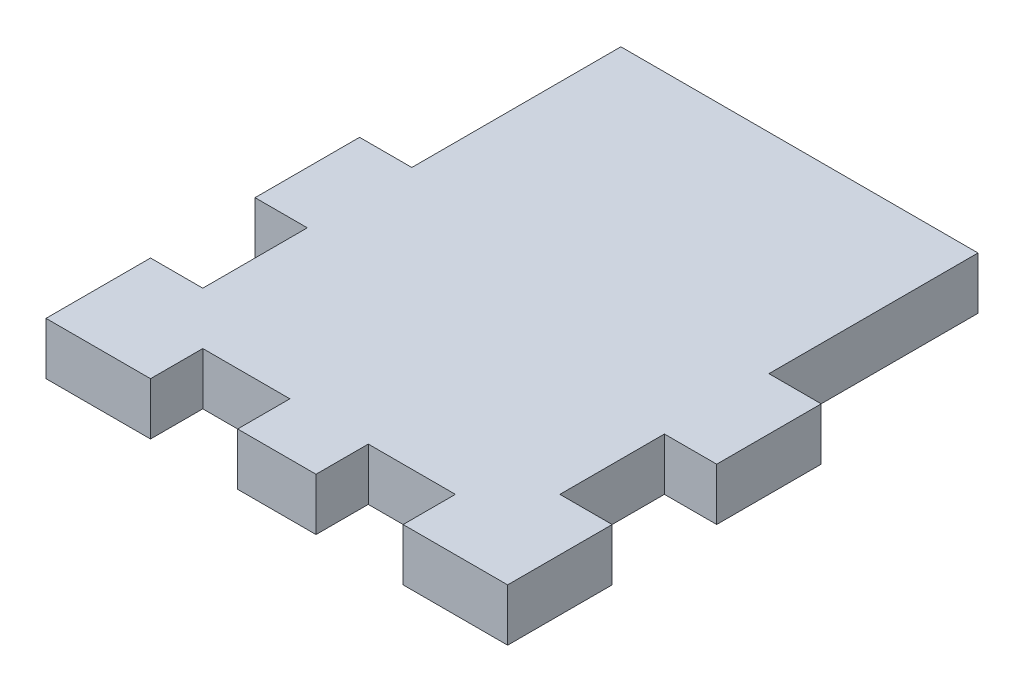
ISO-10303-21;
HEADER;
FILE_DESCRIPTION(('STEP AP214'),'2;1');
FILE_NAME('part.step','',(''),(''),'','','');
FILE_SCHEMA(('AUTOMOTIVE_DESIGN { 1 0 10303 214 1 1 1 1 }'));
ENDSEC;
DATA;
#1=APPLICATION_CONTEXT('core data for automotive mechanical design processes');
#2=APPLICATION_PROTOCOL_DEFINITION('international standard','automotive_design',2000,#1);
#3=PRODUCT_CONTEXT('',#1,'mechanical');
#4=PRODUCT('Part','Part','',(#3));
#5=PRODUCT_RELATED_PRODUCT_CATEGORY('part','',(#4));
#6=PRODUCT_DEFINITION_FORMATION('','',#4);
#7=PRODUCT_DEFINITION_CONTEXT('part definition',#1,'design');
#8=PRODUCT_DEFINITION('design','',#6,#7);
#9=PRODUCT_DEFINITION_SHAPE('','',#8);
#10=(LENGTH_UNIT() NAMED_UNIT(*) SI_UNIT(.MILLI.,.METRE.));
#11=(NAMED_UNIT(*) PLANE_ANGLE_UNIT() SI_UNIT($,.RADIAN.));
#12=(NAMED_UNIT(*) SI_UNIT($,.STERADIAN.) SOLID_ANGLE_UNIT());
#13=UNCERTAINTY_MEASURE_WITH_UNIT(LENGTH_MEASURE(1.E-05),#10,'distance_accuracy_value','');
#14=(GEOMETRIC_REPRESENTATION_CONTEXT(3) GLOBAL_UNCERTAINTY_ASSIGNED_CONTEXT((#13)) GLOBAL_UNIT_ASSIGNED_CONTEXT((#10,
#11,#12)) REPRESENTATION_CONTEXT('',''));
#15=CARTESIAN_POINT('',(0.,0.,0.));
#16=DIRECTION('',(0.,0.,1.));
#17=DIRECTION('',(1.,0.,0.));
#18=AXIS2_PLACEMENT_3D('',#15,#16,#17);
#19=CARTESIAN_POINT('',(6.,3.,0.));
#20=DIRECTION('',(0.,0.,-1.));
#21=DIRECTION('',(-1.,0.,0.));
#22=AXIS2_PLACEMENT_3D('',#19,#20,#21);
#23=PLANE('',#22);
#24=DIRECTION('',(1.,0.,0.));
#25=VECTOR('',#24,1.);
#26=CARTESIAN_POINT('',(6.,0.,0.));
#27=LINE('',#26,#25);
#28=CARTESIAN_POINT('',(0.,0.,0.));
#29=VERTEX_POINT('',#28);
#30=CARTESIAN_POINT('',(6.,0.,0.));
#31=VERTEX_POINT('',#30);
#32=EDGE_CURVE('E225',#29,#31,#27,.T.);
#33=ORIENTED_EDGE('',*,*,#32,.T.);
#34=DIRECTION('',(0.,-1.,0.));
#35=VECTOR('',#34,1.);
#36=CARTESIAN_POINT('',(6.,3.,0.));
#37=LINE('',#36,#35);
#38=CARTESIAN_POINT('',(6.,3.,0.));
#39=VERTEX_POINT('',#38);
#40=EDGE_CURVE('E11',#39,#31,#37,.T.);
#41=ORIENTED_EDGE('',*,*,#40,.F.);
#42=DIRECTION('',(1.,0.,0.));
#43=VECTOR('',#42,1.);
#44=CARTESIAN_POINT('',(6.,3.,0.));
#45=LINE('',#44,#43);
#46=CARTESIAN_POINT('',(0.,3.,0.));
#47=VERTEX_POINT('',#46);
#48=EDGE_CURVE('E271',#47,#39,#45,.T.);
#49=ORIENTED_EDGE('',*,*,#48,.F.);
#50=DIRECTION('',(0.,-1.,0.));
#51=VECTOR('',#50,1.);
#52=CARTESIAN_POINT('',(0.,3.,0.));
#53=LINE('',#52,#51);
#54=EDGE_CURVE('E221',#47,#29,#53,.T.);
#55=ORIENTED_EDGE('',*,*,#54,.T.);
#56=EDGE_LOOP('',(#33,#41,#49,#55));
#57=FACE_BOUND('',#56,.T.);
#58=ADVANCED_FACE('F33',(#57),#23,.F.);
#59=CARTESIAN_POINT('',(6.,3.,-3.));
#60=DIRECTION('',(-1.,0.,0.));
#61=DIRECTION('',(0.,0.,1.));
#62=AXIS2_PLACEMENT_3D('',#59,#60,#61);
#63=PLANE('',#62);
#64=DIRECTION('',(0.,0.,-1.));
#65=VECTOR('',#64,1.);
#66=CARTESIAN_POINT('',(6.,0.,-3.));
#67=LINE('',#66,#65);
#68=CARTESIAN_POINT('',(6.,0.,-3.));
#69=VERTEX_POINT('',#68);
#70=EDGE_CURVE('E228',#31,#69,#67,.T.);
#71=ORIENTED_EDGE('',*,*,#70,.T.);
#72=DIRECTION('',(0.,-1.,0.));
#73=VECTOR('',#72,1.);
#74=CARTESIAN_POINT('',(6.,3.,-3.));
#75=LINE('',#74,#73);
#76=CARTESIAN_POINT('',(6.,3.,-3.));
#77=VERTEX_POINT('',#76);
#78=EDGE_CURVE('E41',#77,#69,#75,.T.);
#79=ORIENTED_EDGE('',*,*,#78,.F.);
#80=DIRECTION('',(0.,0.,-1.));
#81=VECTOR('',#80,1.);
#82=CARTESIAN_POINT('',(6.,3.,-3.));
#83=LINE('',#82,#81);
#84=EDGE_CURVE('E140',#39,#77,#83,.T.);
#85=ORIENTED_EDGE('',*,*,#84,.F.);
#86=ORIENTED_EDGE('',*,*,#40,.T.);
#87=EDGE_LOOP('',(#71,#79,#85,#86));
#88=FACE_BOUND('',#87,.T.);
#89=ADVANCED_FACE('F409',(#88),#63,.F.);
#90=CARTESIAN_POINT('',(11.,3.,-3.));
#91=DIRECTION('',(0.,0.,-1.));
#92=DIRECTION('',(-1.,0.,0.));
#93=AXIS2_PLACEMENT_3D('',#90,#91,#92);
#94=PLANE('',#93);
#95=DIRECTION('',(1.,0.,0.));
#96=VECTOR('',#95,1.);
#97=CARTESIAN_POINT('',(11.,0.,-3.));
#98=LINE('',#97,#96);
#99=CARTESIAN_POINT('',(11.,0.,-3.));
#100=VERTEX_POINT('',#99);
#101=EDGE_CURVE('E230',#69,#100,#98,.T.);
#102=ORIENTED_EDGE('',*,*,#101,.T.);
#103=DIRECTION('',(0.,-1.,0.));
#104=VECTOR('',#103,1.);
#105=CARTESIAN_POINT('',(11.,3.,-3.));
#106=LINE('',#105,#104);
#107=CARTESIAN_POINT('',(11.,3.,-3.));
#108=VERTEX_POINT('',#107);
#109=EDGE_CURVE('E326',#108,#100,#106,.T.);
#110=ORIENTED_EDGE('',*,*,#109,.F.);
#111=DIRECTION('',(1.,0.,0.));
#112=VECTOR('',#111,1.);
#113=CARTESIAN_POINT('',(11.,3.,-3.));
#114=LINE('',#113,#112);
#115=EDGE_CURVE('E334',#77,#108,#114,.T.);
#116=ORIENTED_EDGE('',*,*,#115,.F.);
#117=ORIENTED_EDGE('',*,*,#78,.T.);
#118=EDGE_LOOP('',(#102,#110,#116,#117));
#119=FACE_BOUND('',#118,.T.);
#120=ADVANCED_FACE('F332',(#119),#94,.F.);
#121=CARTESIAN_POINT('',(11.,3.,0.));
#122=DIRECTION('',(1.,0.,0.));
#123=DIRECTION('',(0.,0.,-1.));
#124=AXIS2_PLACEMENT_3D('',#121,#122,#123);
#125=PLANE('',#124);
#126=DIRECTION('',(0.,0.,1.));
#127=VECTOR('',#126,1.);
#128=CARTESIAN_POINT('',(11.,0.,0.));
#129=LINE('',#128,#127);
#130=CARTESIAN_POINT('',(11.,0.,0.));
#131=VERTEX_POINT('',#130);
#132=EDGE_CURVE('E232',#100,#131,#129,.T.);
#133=ORIENTED_EDGE('',*,*,#132,.T.);
#134=DIRECTION('',(0.,-1.,0.));
#135=VECTOR('',#134,1.);
#136=CARTESIAN_POINT('',(11.,3.,0.));
#137=LINE('',#136,#135);
#138=CARTESIAN_POINT('',(11.,3.,0.));
#139=VERTEX_POINT('',#138);
#140=EDGE_CURVE('E323',#139,#131,#137,.T.);
#141=ORIENTED_EDGE('',*,*,#140,.F.);
#142=DIRECTION('',(0.,0.,1.));
#143=VECTOR('',#142,1.);
#144=CARTESIAN_POINT('',(11.,3.,0.));
#145=LINE('',#144,#143);
#146=EDGE_CURVE('E352',#108,#139,#145,.T.);
#147=ORIENTED_EDGE('',*,*,#146,.F.);
#148=ORIENTED_EDGE('',*,*,#109,.T.);
#149=EDGE_LOOP('',(#133,#141,#147,#148));
#150=FACE_BOUND('',#149,.T.);
#151=ADVANCED_FACE('F343',(#150),#125,.F.);
#152=CARTESIAN_POINT('',(15.5,3.,0.));
#153=DIRECTION('',(0.,0.,-1.));
#154=DIRECTION('',(-1.,0.,0.));
#155=AXIS2_PLACEMENT_3D('',#152,#153,#154);
#156=PLANE('',#155);
#157=DIRECTION('',(1.,0.,0.));
#158=VECTOR('',#157,1.);
#159=CARTESIAN_POINT('',(15.5,0.,0.));
#160=LINE('',#159,#158);
#161=CARTESIAN_POINT('',(15.5,0.,0.));
#162=VERTEX_POINT('',#161);
#163=EDGE_CURVE('E234',#131,#162,#160,.T.);
#164=ORIENTED_EDGE('',*,*,#163,.T.);
#165=DIRECTION('',(0.,-1.,0.));
#166=VECTOR('',#165,1.);
#167=CARTESIAN_POINT('',(15.5,3.,0.));
#168=LINE('',#167,#166);
#169=CARTESIAN_POINT('',(15.5,3.,0.));
#170=VERTEX_POINT('',#169);
#171=EDGE_CURVE('E320',#170,#162,#168,.T.);
#172=ORIENTED_EDGE('',*,*,#171,.F.);
#173=DIRECTION('',(1.,0.,0.));
#174=VECTOR('',#173,1.);
#175=CARTESIAN_POINT('',(15.5,3.,0.));
#176=LINE('',#175,#174);
#177=EDGE_CURVE('E349',#139,#170,#176,.T.);
#178=ORIENTED_EDGE('',*,*,#177,.F.);
#179=ORIENTED_EDGE('',*,*,#140,.T.);
#180=EDGE_LOOP('',(#164,#172,#178,#179));
#181=FACE_BOUND('',#180,.T.);
#182=ADVANCED_FACE('F347',(#181),#156,.F.);
#183=CARTESIAN_POINT('',(15.5,3.,-3.));
#184=DIRECTION('',(-1.,0.,0.));
#185=DIRECTION('',(0.,0.,1.));
#186=AXIS2_PLACEMENT_3D('',#183,#184,#185);
#187=PLANE('',#186);
#188=DIRECTION('',(0.,0.,-1.));
#189=VECTOR('',#188,1.);
#190=CARTESIAN_POINT('',(15.5,0.,-3.));
#191=LINE('',#190,#189);
#192=CARTESIAN_POINT('',(15.5,0.,-3.));
#193=VERTEX_POINT('',#192);
#194=EDGE_CURVE('E236',#162,#193,#191,.T.);
#195=ORIENTED_EDGE('',*,*,#194,.T.);
#196=DIRECTION('',(0.,-1.,0.));
#197=VECTOR('',#196,1.);
#198=CARTESIAN_POINT('',(15.5,3.,-3.));
#199=LINE('',#198,#197);
#200=CARTESIAN_POINT('',(15.5,3.,-3.));
#201=VERTEX_POINT('',#200);
#202=EDGE_CURVE('E317',#201,#193,#199,.T.);
#203=ORIENTED_EDGE('',*,*,#202,.F.);
#204=DIRECTION('',(0.,0.,-1.));
#205=VECTOR('',#204,1.);
#206=CARTESIAN_POINT('',(15.5,3.,-3.));
#207=LINE('',#206,#205);
#208=EDGE_CURVE('E351',#170,#201,#207,.T.);
#209=ORIENTED_EDGE('',*,*,#208,.F.);
#210=ORIENTED_EDGE('',*,*,#171,.T.);
#211=EDGE_LOOP('',(#195,#203,#209,#210));
#212=FACE_BOUND('',#211,.T.);
#213=ADVANCED_FACE('F422',(#212),#187,.F.);
#214=CARTESIAN_POINT('',(20.5,3.,-3.));
#215=DIRECTION('',(0.,0.,-1.));
#216=DIRECTION('',(-1.,0.,0.));
#217=AXIS2_PLACEMENT_3D('',#214,#215,#216);
#218=PLANE('',#217);
#219=DIRECTION('',(1.,0.,0.));
#220=VECTOR('',#219,1.);
#221=CARTESIAN_POINT('',(20.5,0.,-3.));
#222=LINE('',#221,#220);
#223=CARTESIAN_POINT('',(20.5,0.,-3.));
#224=VERTEX_POINT('',#223);
#225=EDGE_CURVE('E238',#193,#224,#222,.T.);
#226=ORIENTED_EDGE('',*,*,#225,.T.);
#227=DIRECTION('',(0.,-1.,0.));
#228=VECTOR('',#227,1.);
#229=CARTESIAN_POINT('',(20.5,3.,-3.));
#230=LINE('',#229,#228);
#231=CARTESIAN_POINT('',(20.5,3.,-3.));
#232=VERTEX_POINT('',#231);
#233=EDGE_CURVE('E314',#232,#224,#230,.T.);
#234=ORIENTED_EDGE('',*,*,#233,.F.);
#235=DIRECTION('',(1.,0.,0.));
#236=VECTOR('',#235,1.);
#237=CARTESIAN_POINT('',(20.5,3.,-3.));
#238=LINE('',#237,#236);
#239=EDGE_CURVE('E354',#201,#232,#238,.T.);
#240=ORIENTED_EDGE('',*,*,#239,.F.);
#241=ORIENTED_EDGE('',*,*,#202,.T.);
#242=EDGE_LOOP('',(#226,#234,#240,#241));
#243=FACE_BOUND('',#242,.T.);
#244=ADVANCED_FACE('F425',(#243),#218,.F.);
#245=CARTESIAN_POINT('',(20.5,3.,0.));
#246=DIRECTION('',(1.,0.,0.));
#247=DIRECTION('',(0.,0.,-1.));
#248=AXIS2_PLACEMENT_3D('',#245,#246,#247);
#249=PLANE('',#248);
#250=DIRECTION('',(0.,0.,1.));
#251=VECTOR('',#250,1.);
#252=CARTESIAN_POINT('',(20.5,0.,0.));
#253=LINE('',#252,#251);
#254=CARTESIAN_POINT('',(20.5,0.,0.));
#255=VERTEX_POINT('',#254);
#256=EDGE_CURVE('E240',#224,#255,#253,.T.);
#257=ORIENTED_EDGE('',*,*,#256,.T.);
#258=DIRECTION('',(0.,-1.,0.));
#259=VECTOR('',#258,1.);
#260=CARTESIAN_POINT('',(20.5,3.,0.));
#261=LINE('',#260,#259);
#262=CARTESIAN_POINT('',(20.5,3.,0.));
#263=VERTEX_POINT('',#262);
#264=EDGE_CURVE('E311',#263,#255,#261,.T.);
#265=ORIENTED_EDGE('',*,*,#264,.F.);
#266=DIRECTION('',(0.,0.,1.));
#267=VECTOR('',#266,1.);
#268=CARTESIAN_POINT('',(20.5,3.,0.));
#269=LINE('',#268,#267);
#270=EDGE_CURVE('E360',#232,#263,#269,.T.);
#271=ORIENTED_EDGE('',*,*,#270,.F.);
#272=ORIENTED_EDGE('',*,*,#233,.T.);
#273=EDGE_LOOP('',(#257,#265,#271,#272));
#274=FACE_BOUND('',#273,.T.);
#275=ADVANCED_FACE('F429',(#274),#249,.F.);
#276=CARTESIAN_POINT('',(26.5,3.,0.));
#277=DIRECTION('',(0.,0.,-1.));
#278=DIRECTION('',(-1.,0.,0.));
#279=AXIS2_PLACEMENT_3D('',#276,#277,#278);
#280=PLANE('',#279);
#281=DIRECTION('',(1.,0.,0.));
#282=VECTOR('',#281,1.);
#283=CARTESIAN_POINT('',(26.5,0.,0.));
#284=LINE('',#283,#282);
#285=CARTESIAN_POINT('',(26.5,0.,0.));
#286=VERTEX_POINT('',#285);
#287=EDGE_CURVE('E242',#255,#286,#284,.T.);
#288=ORIENTED_EDGE('',*,*,#287,.T.);
#289=DIRECTION('',(0.,-1.,0.));
#290=VECTOR('',#289,1.);
#291=CARTESIAN_POINT('',(26.5,3.,0.));
#292=LINE('',#291,#290);
#293=CARTESIAN_POINT('',(26.5,3.,0.));
#294=VERTEX_POINT('',#293);
#295=EDGE_CURVE('E308',#294,#286,#292,.T.);
#296=ORIENTED_EDGE('',*,*,#295,.F.);
#297=DIRECTION('',(1.,0.,0.));
#298=VECTOR('',#297,1.);
#299=CARTESIAN_POINT('',(26.5,3.,0.));
#300=LINE('',#299,#298);
#301=EDGE_CURVE('E362',#263,#294,#300,.T.);
#302=ORIENTED_EDGE('',*,*,#301,.F.);
#303=ORIENTED_EDGE('',*,*,#264,.T.);
#304=EDGE_LOOP('',(#288,#296,#302,#303));
#305=FACE_BOUND('',#304,.T.);
#306=ADVANCED_FACE('F433',(#305),#280,.F.);
#307=CARTESIAN_POINT('',(26.5,3.,-6.));
#308=DIRECTION('',(-1.,0.,0.));
#309=DIRECTION('',(0.,0.,1.));
#310=AXIS2_PLACEMENT_3D('',#307,#308,#309);
#311=PLANE('',#310);
#312=DIRECTION('',(0.,0.,-1.));
#313=VECTOR('',#312,1.);
#314=CARTESIAN_POINT('',(26.5,0.,-6.));
#315=LINE('',#314,#313);
#316=CARTESIAN_POINT('',(26.5,0.,-6.));
#317=VERTEX_POINT('',#316);
#318=EDGE_CURVE('E244',#286,#317,#315,.T.);
#319=ORIENTED_EDGE('',*,*,#318,.T.);
#320=DIRECTION('',(0.,-1.,0.));
#321=VECTOR('',#320,1.);
#322=CARTESIAN_POINT('',(26.5,3.,-6.));
#323=LINE('',#322,#321);
#324=CARTESIAN_POINT('',(26.5,3.,-6.));
#325=VERTEX_POINT('',#324);
#326=EDGE_CURVE('E305',#325,#317,#323,.T.);
#327=ORIENTED_EDGE('',*,*,#326,.F.);
#328=DIRECTION('',(0.,0.,-1.));
#329=VECTOR('',#328,1.);
#330=CARTESIAN_POINT('',(26.5,3.,-6.));
#331=LINE('',#330,#329);
#332=EDGE_CURVE('E364',#294,#325,#331,.T.);
#333=ORIENTED_EDGE('',*,*,#332,.F.);
#334=ORIENTED_EDGE('',*,*,#295,.T.);
#335=EDGE_LOOP('',(#319,#327,#333,#334));
#336=FACE_BOUND('',#335,.T.);
#337=ADVANCED_FACE('F437',(#336),#311,.F.);
#338=CARTESIAN_POINT('',(23.5,3.,-6.));
#339=DIRECTION('',(0.,0.,1.));
#340=DIRECTION('',(1.,0.,0.));
#341=AXIS2_PLACEMENT_3D('',#338,#339,#340);
#342=PLANE('',#341);
#343=DIRECTION('',(-1.,0.,0.));
#344=VECTOR('',#343,1.);
#345=CARTESIAN_POINT('',(23.5,0.,-6.));
#346=LINE('',#345,#344);
#347=CARTESIAN_POINT('',(23.5,0.,-6.));
#348=VERTEX_POINT('',#347);
#349=EDGE_CURVE('E246',#317,#348,#346,.T.);
#350=ORIENTED_EDGE('',*,*,#349,.T.);
#351=DIRECTION('',(0.,-1.,0.));
#352=VECTOR('',#351,1.);
#353=CARTESIAN_POINT('',(23.5,3.,-6.));
#354=LINE('',#353,#352);
#355=CARTESIAN_POINT('',(23.5,3.,-6.));
#356=VERTEX_POINT('',#355);
#357=EDGE_CURVE('E302',#356,#348,#354,.T.);
#358=ORIENTED_EDGE('',*,*,#357,.F.);
#359=DIRECTION('',(-1.,0.,0.));
#360=VECTOR('',#359,1.);
#361=CARTESIAN_POINT('',(23.5,3.,-6.));
#362=LINE('',#361,#360);
#363=EDGE_CURVE('E366',#325,#356,#362,.T.);
#364=ORIENTED_EDGE('',*,*,#363,.F.);
#365=ORIENTED_EDGE('',*,*,#326,.T.);
#366=EDGE_LOOP('',(#350,#358,#364,#365));
#367=FACE_BOUND('',#366,.T.);
#368=ADVANCED_FACE('F441',(#367),#342,.F.);
#369=CARTESIAN_POINT('',(23.5,3.,-12.));
#370=DIRECTION('',(-1.,0.,0.));
#371=DIRECTION('',(0.,0.,1.));
#372=AXIS2_PLACEMENT_3D('',#369,#370,#371);
#373=PLANE('',#372);
#374=DIRECTION('',(0.,0.,-1.));
#375=VECTOR('',#374,1.);
#376=CARTESIAN_POINT('',(23.5,0.,-12.));
#377=LINE('',#376,#375);
#378=CARTESIAN_POINT('',(23.5,0.,-12.));
#379=VERTEX_POINT('',#378);
#380=EDGE_CURVE('E248',#348,#379,#377,.T.);
#381=ORIENTED_EDGE('',*,*,#380,.T.);
#382=DIRECTION('',(0.,-1.,0.));
#383=VECTOR('',#382,1.);
#384=CARTESIAN_POINT('',(23.5,3.,-12.));
#385=LINE('',#384,#383);
#386=CARTESIAN_POINT('',(23.5,3.,-12.));
#387=VERTEX_POINT('',#386);
#388=EDGE_CURVE('E299',#387,#379,#385,.T.);
#389=ORIENTED_EDGE('',*,*,#388,.F.);
#390=DIRECTION('',(0.,0.,-1.));
#391=VECTOR('',#390,1.);
#392=CARTESIAN_POINT('',(23.5,3.,-12.));
#393=LINE('',#392,#391);
#394=EDGE_CURVE('E368',#356,#387,#393,.T.);
#395=ORIENTED_EDGE('',*,*,#394,.F.);
#396=ORIENTED_EDGE('',*,*,#357,.T.);
#397=EDGE_LOOP('',(#381,#389,#395,#396));
#398=FACE_BOUND('',#397,.T.);
#399=ADVANCED_FACE('F445',(#398),#373,.F.);
#400=CARTESIAN_POINT('',(26.5,3.,-12.));
#401=DIRECTION('',(0.,0.,-1.));
#402=DIRECTION('',(-1.,0.,0.));
#403=AXIS2_PLACEMENT_3D('',#400,#401,#402);
#404=PLANE('',#403);
#405=DIRECTION('',(1.,0.,0.));
#406=VECTOR('',#405,1.);
#407=CARTESIAN_POINT('',(26.5,0.,-12.));
#408=LINE('',#407,#406);
#409=CARTESIAN_POINT('',(26.5,0.,-12.));
#410=VERTEX_POINT('',#409);
#411=EDGE_CURVE('E250',#379,#410,#408,.T.);
#412=ORIENTED_EDGE('',*,*,#411,.T.);
#413=DIRECTION('',(0.,-1.,0.));
#414=VECTOR('',#413,1.);
#415=CARTESIAN_POINT('',(26.5,3.,-12.));
#416=LINE('',#415,#414);
#417=CARTESIAN_POINT('',(26.5,3.,-12.));
#418=VERTEX_POINT('',#417);
#419=EDGE_CURVE('E296',#418,#410,#416,.T.);
#420=ORIENTED_EDGE('',*,*,#419,.F.);
#421=DIRECTION('',(1.,0.,0.));
#422=VECTOR('',#421,1.);
#423=CARTESIAN_POINT('',(26.5,3.,-12.));
#424=LINE('',#423,#422);
#425=EDGE_CURVE('E370',#387,#418,#424,.T.);
#426=ORIENTED_EDGE('',*,*,#425,.F.);
#427=ORIENTED_EDGE('',*,*,#388,.T.);
#428=EDGE_LOOP('',(#412,#420,#426,#427));
#429=FACE_BOUND('',#428,.T.);
#430=ADVANCED_FACE('F449',(#429),#404,.F.);
#431=CARTESIAN_POINT('',(26.5,3.,-18.));
#432=DIRECTION('',(-1.,0.,0.));
#433=DIRECTION('',(0.,0.,1.));
#434=AXIS2_PLACEMENT_3D('',#431,#432,#433);
#435=PLANE('',#434);
#436=DIRECTION('',(0.,0.,-1.));
#437=VECTOR('',#436,1.);
#438=CARTESIAN_POINT('',(26.5,0.,-18.));
#439=LINE('',#438,#437);
#440=CARTESIAN_POINT('',(26.5,0.,-18.));
#441=VERTEX_POINT('',#440);
#442=EDGE_CURVE('E252',#410,#441,#439,.T.);
#443=ORIENTED_EDGE('',*,*,#442,.T.);
#444=DIRECTION('',(0.,-1.,0.));
#445=VECTOR('',#444,1.);
#446=CARTESIAN_POINT('',(26.5,3.,-18.));
#447=LINE('',#446,#445);
#448=CARTESIAN_POINT('',(26.5,3.,-18.));
#449=VERTEX_POINT('',#448);
#450=EDGE_CURVE('E293',#449,#441,#447,.T.);
#451=ORIENTED_EDGE('',*,*,#450,.F.);
#452=DIRECTION('',(0.,0.,-1.));
#453=VECTOR('',#452,1.);
#454=CARTESIAN_POINT('',(26.5,3.,-18.));
#455=LINE('',#454,#453);
#456=EDGE_CURVE('E372',#418,#449,#455,.T.);
#457=ORIENTED_EDGE('',*,*,#456,.F.);
#458=ORIENTED_EDGE('',*,*,#419,.T.);
#459=EDGE_LOOP('',(#443,#451,#457,#458));
#460=FACE_BOUND('',#459,.T.);
#461=ADVANCED_FACE('F453',(#460),#435,.F.);
#462=CARTESIAN_POINT('',(23.5,3.,-18.));
#463=DIRECTION('',(0.,0.,1.));
#464=DIRECTION('',(1.,0.,0.));
#465=AXIS2_PLACEMENT_3D('',#462,#463,#464);
#466=PLANE('',#465);
#467=DIRECTION('',(-1.,0.,0.));
#468=VECTOR('',#467,1.);
#469=CARTESIAN_POINT('',(23.5,0.,-18.));
#470=LINE('',#469,#468);
#471=CARTESIAN_POINT('',(23.5,0.,-18.));
#472=VERTEX_POINT('',#471);
#473=EDGE_CURVE('E254',#441,#472,#470,.T.);
#474=ORIENTED_EDGE('',*,*,#473,.T.);
#475=DIRECTION('',(0.,-1.,0.));
#476=VECTOR('',#475,1.);
#477=CARTESIAN_POINT('',(23.5,3.,-18.));
#478=LINE('',#477,#476);
#479=CARTESIAN_POINT('',(23.5,3.,-18.));
#480=VERTEX_POINT('',#479);
#481=EDGE_CURVE('E290',#480,#472,#478,.T.);
#482=ORIENTED_EDGE('',*,*,#481,.F.);
#483=DIRECTION('',(-1.,0.,0.));
#484=VECTOR('',#483,1.);
#485=CARTESIAN_POINT('',(23.5,3.,-18.));
#486=LINE('',#485,#484);
#487=EDGE_CURVE('E374',#449,#480,#486,.T.);
#488=ORIENTED_EDGE('',*,*,#487,.F.);
#489=ORIENTED_EDGE('',*,*,#450,.T.);
#490=EDGE_LOOP('',(#474,#482,#488,#489));
#491=FACE_BOUND('',#490,.T.);
#492=ADVANCED_FACE('F457',(#491),#466,.F.);
#493=CARTESIAN_POINT('',(23.5,3.,-30.));
#494=DIRECTION('',(-1.,0.,0.));
#495=DIRECTION('',(0.,0.,1.));
#496=AXIS2_PLACEMENT_3D('',#493,#494,#495);
#497=PLANE('',#496);
#498=DIRECTION('',(0.,0.,-1.));
#499=VECTOR('',#498,1.);
#500=CARTESIAN_POINT('',(23.5,0.,-30.));
#501=LINE('',#500,#499);
#502=CARTESIAN_POINT('',(23.5,0.,-30.));
#503=VERTEX_POINT('',#502);
#504=EDGE_CURVE('E256',#472,#503,#501,.T.);
#505=ORIENTED_EDGE('',*,*,#504,.T.);
#506=DIRECTION('',(0.,-1.,0.));
#507=VECTOR('',#506,1.);
#508=CARTESIAN_POINT('',(23.5,3.,-30.));
#509=LINE('',#508,#507);
#510=CARTESIAN_POINT('',(23.5,3.,-30.));
#511=VERTEX_POINT('',#510);
#512=EDGE_CURVE('E287',#511,#503,#509,.T.);
#513=ORIENTED_EDGE('',*,*,#512,.F.);
#514=DIRECTION('',(0.,0.,-1.));
#515=VECTOR('',#514,1.);
#516=CARTESIAN_POINT('',(23.5,3.,-30.));
#517=LINE('',#516,#515);
#518=EDGE_CURVE('E376',#480,#511,#517,.T.);
#519=ORIENTED_EDGE('',*,*,#518,.F.);
#520=ORIENTED_EDGE('',*,*,#481,.T.);
#521=EDGE_LOOP('',(#505,#513,#519,#520));
#522=FACE_BOUND('',#521,.T.);
#523=ADVANCED_FACE('F461',(#522),#497,.F.);
#524=CARTESIAN_POINT('',(3.,3.,-30.));
#525=DIRECTION('',(0.,0.,1.));
#526=DIRECTION('',(1.,0.,0.));
#527=AXIS2_PLACEMENT_3D('',#524,#525,#526);
#528=PLANE('',#527);
#529=DIRECTION('',(-1.,0.,0.));
#530=VECTOR('',#529,1.);
#531=CARTESIAN_POINT('',(3.,0.,-30.));
#532=LINE('',#531,#530);
#533=CARTESIAN_POINT('',(3.,0.,-30.));
#534=VERTEX_POINT('',#533);
#535=EDGE_CURVE('E258',#503,#534,#532,.T.);
#536=ORIENTED_EDGE('',*,*,#535,.T.);
#537=DIRECTION('',(0.,-1.,0.));
#538=VECTOR('',#537,1.);
#539=CARTESIAN_POINT('',(3.,3.,-30.));
#540=LINE('',#539,#538);
#541=CARTESIAN_POINT('',(3.,3.,-30.));
#542=VERTEX_POINT('',#541);
#543=EDGE_CURVE('E284',#542,#534,#540,.T.);
#544=ORIENTED_EDGE('',*,*,#543,.F.);
#545=DIRECTION('',(-1.,0.,0.));
#546=VECTOR('',#545,1.);
#547=CARTESIAN_POINT('',(3.,3.,-30.));
#548=LINE('',#547,#546);
#549=EDGE_CURVE('E378',#511,#542,#548,.T.);
#550=ORIENTED_EDGE('',*,*,#549,.F.);
#551=ORIENTED_EDGE('',*,*,#512,.T.);
#552=EDGE_LOOP('',(#536,#544,#550,#551));
#553=FACE_BOUND('',#552,.T.);
#554=ADVANCED_FACE('F465',(#553),#528,.F.);
#555=CARTESIAN_POINT('',(3.,3.,-18.));
#556=DIRECTION('',(1.,0.,0.));
#557=DIRECTION('',(0.,0.,-1.));
#558=AXIS2_PLACEMENT_3D('',#555,#556,#557);
#559=PLANE('',#558);
#560=DIRECTION('',(0.,0.,1.));
#561=VECTOR('',#560,1.);
#562=CARTESIAN_POINT('',(3.,0.,-18.));
#563=LINE('',#562,#561);
#564=CARTESIAN_POINT('',(3.,0.,-18.));
#565=VERTEX_POINT('',#564);
#566=EDGE_CURVE('E260',#534,#565,#563,.T.);
#567=ORIENTED_EDGE('',*,*,#566,.T.);
#568=DIRECTION('',(0.,-1.,0.));
#569=VECTOR('',#568,1.);
#570=CARTESIAN_POINT('',(3.,3.,-18.));
#571=LINE('',#570,#569);
#572=CARTESIAN_POINT('',(3.,3.,-18.));
#573=VERTEX_POINT('',#572);
#574=EDGE_CURVE('E281',#573,#565,#571,.T.);
#575=ORIENTED_EDGE('',*,*,#574,.F.);
#576=DIRECTION('',(0.,0.,1.));
#577=VECTOR('',#576,1.);
#578=CARTESIAN_POINT('',(3.,3.,-18.));
#579=LINE('',#578,#577);
#580=EDGE_CURVE('E380',#542,#573,#579,.T.);
#581=ORIENTED_EDGE('',*,*,#580,.F.);
#582=ORIENTED_EDGE('',*,*,#543,.T.);
#583=EDGE_LOOP('',(#567,#575,#581,#582));
#584=FACE_BOUND('',#583,.T.);
#585=ADVANCED_FACE('F469',(#584),#559,.F.);
#586=CARTESIAN_POINT('',(0.,3.,-18.));
#587=DIRECTION('',(0.,0.,1.));
#588=DIRECTION('',(1.,0.,0.));
#589=AXIS2_PLACEMENT_3D('',#586,#587,#588);
#590=PLANE('',#589);
#591=DIRECTION('',(-1.,0.,0.));
#592=VECTOR('',#591,1.);
#593=CARTESIAN_POINT('',(0.,0.,-18.));
#594=LINE('',#593,#592);
#595=CARTESIAN_POINT('',(0.,0.,-18.));
#596=VERTEX_POINT('',#595);
#597=EDGE_CURVE('E262',#565,#596,#594,.T.);
#598=ORIENTED_EDGE('',*,*,#597,.T.);
#599=DIRECTION('',(0.,-1.,0.));
#600=VECTOR('',#599,1.);
#601=CARTESIAN_POINT('',(0.,3.,-18.));
#602=LINE('',#601,#600);
#603=CARTESIAN_POINT('',(0.,3.,-18.));
#604=VERTEX_POINT('',#603);
#605=EDGE_CURVE('E278',#604,#596,#602,.T.);
#606=ORIENTED_EDGE('',*,*,#605,.F.);
#607=DIRECTION('',(-1.,0.,0.));
#608=VECTOR('',#607,1.);
#609=CARTESIAN_POINT('',(0.,3.,-18.));
#610=LINE('',#609,#608);
#611=EDGE_CURVE('E382',#573,#604,#610,.T.);
#612=ORIENTED_EDGE('',*,*,#611,.F.);
#613=ORIENTED_EDGE('',*,*,#574,.T.);
#614=EDGE_LOOP('',(#598,#606,#612,#613));
#615=FACE_BOUND('',#614,.T.);
#616=ADVANCED_FACE('F473',(#615),#590,.F.);
#617=CARTESIAN_POINT('',(0.,3.,-12.));
#618=DIRECTION('',(1.,0.,0.));
#619=DIRECTION('',(0.,0.,-1.));
#620=AXIS2_PLACEMENT_3D('',#617,#618,#619);
#621=PLANE('',#620);
#622=DIRECTION('',(0.,0.,1.));
#623=VECTOR('',#622,1.);
#624=CARTESIAN_POINT('',(0.,0.,-12.));
#625=LINE('',#624,#623);
#626=CARTESIAN_POINT('',(0.,0.,-12.));
#627=VERTEX_POINT('',#626);
#628=EDGE_CURVE('E264',#596,#627,#625,.T.);
#629=ORIENTED_EDGE('',*,*,#628,.T.);
#630=DIRECTION('',(0.,-1.,0.));
#631=VECTOR('',#630,1.);
#632=CARTESIAN_POINT('',(0.,3.,-12.));
#633=LINE('',#632,#631);
#634=CARTESIAN_POINT('',(0.,3.,-12.));
#635=VERTEX_POINT('',#634);
#636=EDGE_CURVE('E275',#635,#627,#633,.T.);
#637=ORIENTED_EDGE('',*,*,#636,.F.);
#638=DIRECTION('',(0.,0.,1.));
#639=VECTOR('',#638,1.);
#640=CARTESIAN_POINT('',(0.,3.,-12.));
#641=LINE('',#640,#639);
#642=EDGE_CURVE('E384',#604,#635,#641,.T.);
#643=ORIENTED_EDGE('',*,*,#642,.F.);
#644=ORIENTED_EDGE('',*,*,#605,.T.);
#645=EDGE_LOOP('',(#629,#637,#643,#644));
#646=FACE_BOUND('',#645,.T.);
#647=ADVANCED_FACE('F390',(#646),#621,.F.);
#648=CARTESIAN_POINT('',(3.,3.,-12.));
#649=DIRECTION('',(0.,0.,-1.));
#650=DIRECTION('',(-1.,0.,0.));
#651=AXIS2_PLACEMENT_3D('',#648,#649,#650);
#652=PLANE('',#651);
#653=DIRECTION('',(1.,0.,0.));
#654=VECTOR('',#653,1.);
#655=CARTESIAN_POINT('',(3.,0.,-12.));
#656=LINE('',#655,#654);
#657=CARTESIAN_POINT('',(3.,0.,-12.));
#658=VERTEX_POINT('',#657);
#659=EDGE_CURVE('E266',#627,#658,#656,.T.);
#660=ORIENTED_EDGE('',*,*,#659,.T.);
#661=DIRECTION('',(0.,-1.,0.));
#662=VECTOR('',#661,1.);
#663=CARTESIAN_POINT('',(3.,3.,-12.));
#664=LINE('',#663,#662);
#665=CARTESIAN_POINT('',(3.,3.,-12.));
#666=VERTEX_POINT('',#665);
#667=EDGE_CURVE('E216',#666,#658,#664,.T.);
#668=ORIENTED_EDGE('',*,*,#667,.F.);
#669=DIRECTION('',(1.,0.,0.));
#670=VECTOR('',#669,1.);
#671=CARTESIAN_POINT('',(3.,3.,-12.));
#672=LINE('',#671,#670);
#673=EDGE_CURVE('E207',#635,#666,#672,.T.);
#674=ORIENTED_EDGE('',*,*,#673,.F.);
#675=ORIENTED_EDGE('',*,*,#636,.T.);
#676=EDGE_LOOP('',(#660,#668,#674,#675));
#677=FACE_BOUND('',#676,.T.);
#678=ADVANCED_FACE('F394',(#677),#652,.F.);
#679=CARTESIAN_POINT('',(3.,3.,-6.));
#680=DIRECTION('',(1.,0.,0.));
#681=DIRECTION('',(0.,0.,-1.));
#682=AXIS2_PLACEMENT_3D('',#679,#680,#681);
#683=PLANE('',#682);
#684=DIRECTION('',(0.,0.,1.));
#685=VECTOR('',#684,1.);
#686=CARTESIAN_POINT('',(3.,0.,-6.));
#687=LINE('',#686,#685);
#688=CARTESIAN_POINT('',(3.,0.,-6.));
#689=VERTEX_POINT('',#688);
#690=EDGE_CURVE('E215',#658,#689,#687,.T.);
#691=ORIENTED_EDGE('',*,*,#690,.T.);
#692=DIRECTION('',(0.,-1.,0.));
#693=VECTOR('',#692,1.);
#694=CARTESIAN_POINT('',(3.,3.,-6.));
#695=LINE('',#694,#693);
#696=CARTESIAN_POINT('',(3.,3.,-6.));
#697=VERTEX_POINT('',#696);
#698=EDGE_CURVE('E212',#697,#689,#695,.T.);
#699=ORIENTED_EDGE('',*,*,#698,.F.);
#700=DIRECTION('',(0.,0.,1.));
#701=VECTOR('',#700,1.);
#702=CARTESIAN_POINT('',(3.,3.,-6.));
#703=LINE('',#702,#701);
#704=EDGE_CURVE('E201',#666,#697,#703,.T.);
#705=ORIENTED_EDGE('',*,*,#704,.F.);
#706=ORIENTED_EDGE('',*,*,#667,.T.);
#707=EDGE_LOOP('',(#691,#699,#705,#706));
#708=FACE_BOUND('',#707,.T.);
#709=ADVANCED_FACE('F213',(#708),#683,.F.);
#710=CARTESIAN_POINT('',(0.,3.,-6.));
#711=DIRECTION('',(0.,0.,1.));
#712=DIRECTION('',(1.,0.,0.));
#713=AXIS2_PLACEMENT_3D('',#710,#711,#712);
#714=PLANE('',#713);
#715=DIRECTION('',(-1.,0.,0.));
#716=VECTOR('',#715,1.);
#717=CARTESIAN_POINT('',(0.,0.,-6.));
#718=LINE('',#717,#716);
#719=CARTESIAN_POINT('',(0.,0.,-6.));
#720=VERTEX_POINT('',#719);
#721=EDGE_CURVE('E126',#689,#720,#718,.T.);
#722=ORIENTED_EDGE('',*,*,#721,.T.);
#723=DIRECTION('',(0.,-1.,0.));
#724=VECTOR('',#723,1.);
#725=CARTESIAN_POINT('',(0.,3.,-6.));
#726=LINE('',#725,#724);
#727=CARTESIAN_POINT('',(0.,3.,-6.));
#728=VERTEX_POINT('',#727);
#729=EDGE_CURVE('E217',#728,#720,#726,.T.);
#730=ORIENTED_EDGE('',*,*,#729,.F.);
#731=DIRECTION('',(-1.,0.,0.));
#732=VECTOR('',#731,1.);
#733=CARTESIAN_POINT('',(0.,3.,-6.));
#734=LINE('',#733,#732);
#735=EDGE_CURVE('E205',#697,#728,#734,.T.);
#736=ORIENTED_EDGE('',*,*,#735,.F.);
#737=ORIENTED_EDGE('',*,*,#698,.T.);
#738=EDGE_LOOP('',(#722,#730,#736,#737));
#739=FACE_BOUND('',#738,.T.);
#740=ADVANCED_FACE('F219',(#739),#714,.F.);
#741=CARTESIAN_POINT('',(0.,3.,0.));
#742=DIRECTION('',(1.,0.,0.));
#743=DIRECTION('',(0.,0.,-1.));
#744=AXIS2_PLACEMENT_3D('',#741,#742,#743);
#745=PLANE('',#744);
#746=DIRECTION('',(0.,0.,1.));
#747=VECTOR('',#746,1.);
#748=CARTESIAN_POINT('',(0.,0.,0.));
#749=LINE('',#748,#747);
#750=EDGE_CURVE('E132',#720,#29,#749,.T.);
#751=ORIENTED_EDGE('',*,*,#750,.T.);
#752=ORIENTED_EDGE('',*,*,#54,.F.);
#753=DIRECTION('',(0.,0.,1.));
#754=VECTOR('',#753,1.);
#755=CARTESIAN_POINT('',(0.,3.,0.));
#756=LINE('',#755,#754);
#757=EDGE_CURVE('E49',#728,#47,#756,.T.);
#758=ORIENTED_EDGE('',*,*,#757,.F.);
#759=ORIENTED_EDGE('',*,*,#729,.T.);
#760=EDGE_LOOP('',(#751,#752,#758,#759));
#761=FACE_BOUND('',#760,.T.);
#762=ADVANCED_FACE('F398',(#761),#745,.F.);
#763=CARTESIAN_POINT('',(0.,3.,0.));
#764=DIRECTION('',(0.,-1.,0.));
#765=DIRECTION('',(0.,0.,-1.));
#766=AXIS2_PLACEMENT_3D('',#763,#764,#765);
#767=PLANE('',#766);
#768=ORIENTED_EDGE('',*,*,#48,.T.);
#769=ORIENTED_EDGE('',*,*,#84,.T.);
#770=ORIENTED_EDGE('',*,*,#115,.T.);
#771=ORIENTED_EDGE('',*,*,#146,.T.);
#772=ORIENTED_EDGE('',*,*,#177,.T.);
#773=ORIENTED_EDGE('',*,*,#208,.T.);
#774=ORIENTED_EDGE('',*,*,#239,.T.);
#775=ORIENTED_EDGE('',*,*,#270,.T.);
#776=ORIENTED_EDGE('',*,*,#301,.T.);
#777=ORIENTED_EDGE('',*,*,#332,.T.);
#778=ORIENTED_EDGE('',*,*,#363,.T.);
#779=ORIENTED_EDGE('',*,*,#394,.T.);
#780=ORIENTED_EDGE('',*,*,#425,.T.);
#781=ORIENTED_EDGE('',*,*,#456,.T.);
#782=ORIENTED_EDGE('',*,*,#487,.T.);
#783=ORIENTED_EDGE('',*,*,#518,.T.);
#784=ORIENTED_EDGE('',*,*,#549,.T.);
#785=ORIENTED_EDGE('',*,*,#580,.T.);
#786=ORIENTED_EDGE('',*,*,#611,.T.);
#787=ORIENTED_EDGE('',*,*,#642,.T.);
#788=ORIENTED_EDGE('',*,*,#673,.T.);
#789=ORIENTED_EDGE('',*,*,#704,.T.);
#790=ORIENTED_EDGE('',*,*,#735,.T.);
#791=ORIENTED_EDGE('',*,*,#757,.T.);
#792=EDGE_LOOP('',(#768,#769,#770,#771,#772,#773,#774,#775,#776,#777,#778,#779,#780,#781,#782,
#783,#784,#785,#786,#787,#788,#789,#790,#791));
#793=FACE_BOUND('',#792,.T.);
#794=ADVANCED_FACE('F203',(#793),#767,.F.);
#795=CARTESIAN_POINT('',(0.,0.,0.));
#796=DIRECTION('',(0.,-1.,0.));
#797=DIRECTION('',(0.,0.,-1.));
#798=AXIS2_PLACEMENT_3D('',#795,#796,#797);
#799=PLANE('',#798);
#800=ORIENTED_EDGE('',*,*,#32,.F.);
#801=ORIENTED_EDGE('',*,*,#750,.F.);
#802=ORIENTED_EDGE('',*,*,#721,.F.);
#803=ORIENTED_EDGE('',*,*,#690,.F.);
#804=ORIENTED_EDGE('',*,*,#659,.F.);
#805=ORIENTED_EDGE('',*,*,#628,.F.);
#806=ORIENTED_EDGE('',*,*,#597,.F.);
#807=ORIENTED_EDGE('',*,*,#566,.F.);
#808=ORIENTED_EDGE('',*,*,#535,.F.);
#809=ORIENTED_EDGE('',*,*,#504,.F.);
#810=ORIENTED_EDGE('',*,*,#473,.F.);
#811=ORIENTED_EDGE('',*,*,#442,.F.);
#812=ORIENTED_EDGE('',*,*,#411,.F.);
#813=ORIENTED_EDGE('',*,*,#380,.F.);
#814=ORIENTED_EDGE('',*,*,#349,.F.);
#815=ORIENTED_EDGE('',*,*,#318,.F.);
#816=ORIENTED_EDGE('',*,*,#287,.F.);
#817=ORIENTED_EDGE('',*,*,#256,.F.);
#818=ORIENTED_EDGE('',*,*,#225,.F.);
#819=ORIENTED_EDGE('',*,*,#194,.F.);
#820=ORIENTED_EDGE('',*,*,#163,.F.);
#821=ORIENTED_EDGE('',*,*,#132,.F.);
#822=ORIENTED_EDGE('',*,*,#101,.F.);
#823=ORIENTED_EDGE('',*,*,#70,.F.);
#824=EDGE_LOOP('',(#800,#801,#802,#803,#804,#805,#806,#807,#808,#809,#810,#811,#812,#813,#814,
#815,#816,#817,#818,#819,#820,#821,#822,#823));
#825=FACE_BOUND('',#824,.T.);
#826=ADVANCED_FACE('F338',(#825),#799,.T.);
#827=CLOSED_SHELL('',(#58,#89,#120,#151,#182,#213,#244,#275,#306,#337,#368,#399,#430,#461,#492,
#523,#554,#585,#616,#647,#678,#709,#740,#762,#794,#826));
#828=MANIFOLD_SOLID_BREP('B2',#827);
#829=ADVANCED_BREP_SHAPE_REPRESENTATION('',(#18,#828),#14);
#830=SHAPE_DEFINITION_REPRESENTATION(#9,#829);
ENDSEC;
END-ISO-10303-21;
